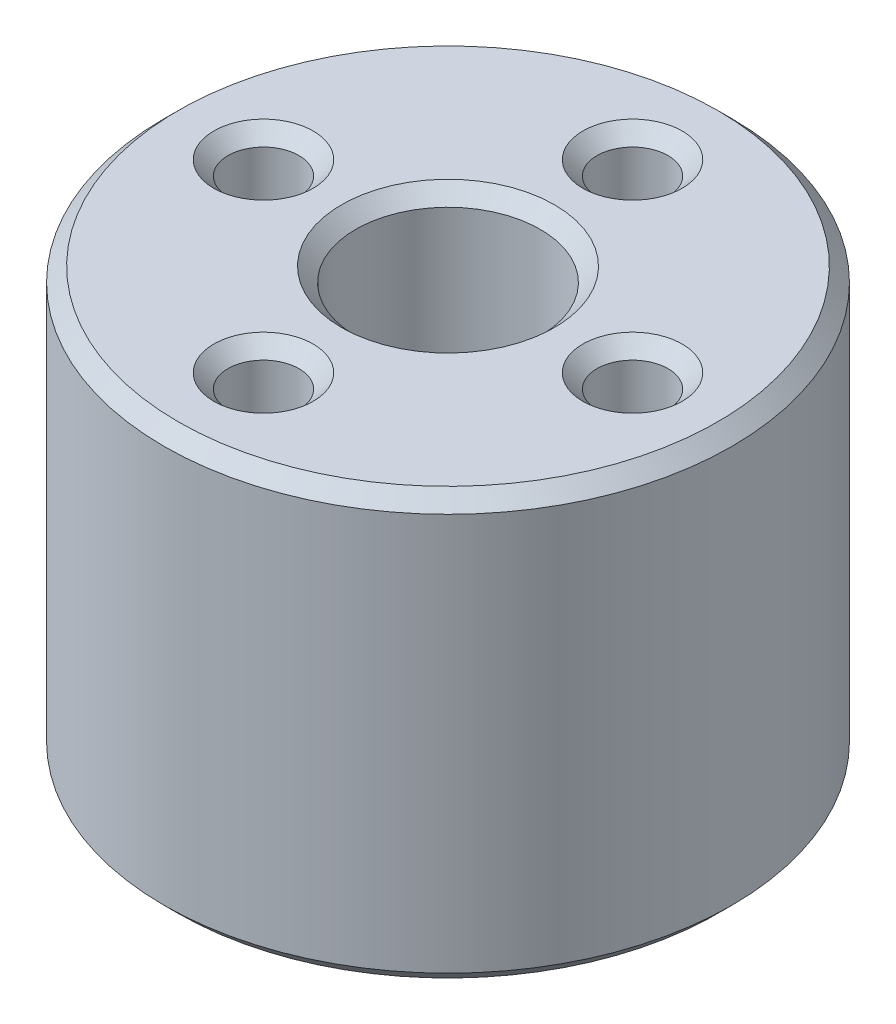
ISO-10303-21;
HEADER;
FILE_DESCRIPTION(('STEP AP214'),'2;1');
FILE_NAME('part.step','',(''),(''),'','','');
FILE_SCHEMA(('AUTOMOTIVE_DESIGN { 1 0 10303 214 1 1 1 1 }'));
ENDSEC;
DATA;
#1=APPLICATION_CONTEXT('core data for automotive mechanical design processes');
#2=APPLICATION_PROTOCOL_DEFINITION('international standard','automotive_design',2000,#1);
#3=PRODUCT_CONTEXT('',#1,'mechanical');
#4=PRODUCT('Part','Part','',(#3));
#5=PRODUCT_RELATED_PRODUCT_CATEGORY('part','',(#4));
#6=PRODUCT_DEFINITION_FORMATION('','',#4);
#7=PRODUCT_DEFINITION_CONTEXT('part definition',#1,'design');
#8=PRODUCT_DEFINITION('design','',#6,#7);
#9=PRODUCT_DEFINITION_SHAPE('','',#8);
#10=(LENGTH_UNIT() NAMED_UNIT(*) SI_UNIT(.MILLI.,.METRE.));
#11=(NAMED_UNIT(*) PLANE_ANGLE_UNIT() SI_UNIT($,.RADIAN.));
#12=(NAMED_UNIT(*) SI_UNIT($,.STERADIAN.) SOLID_ANGLE_UNIT());
#13=UNCERTAINTY_MEASURE_WITH_UNIT(LENGTH_MEASURE(1.E-05),#10,'distance_accuracy_value','');
#14=(GEOMETRIC_REPRESENTATION_CONTEXT(3) GLOBAL_UNCERTAINTY_ASSIGNED_CONTEXT((#13)) GLOBAL_UNIT_ASSIGNED_CONTEXT((#10,
#11,#12)) REPRESENTATION_CONTEXT('',''));
#15=CARTESIAN_POINT('',(0.,0.,0.));
#16=DIRECTION('',(0.,0.,1.));
#17=DIRECTION('',(1.,0.,0.));
#18=AXIS2_PLACEMENT_3D('',#15,#16,#17);
#19=CARTESIAN_POINT('',(0.,15.,0.));
#20=DIRECTION('',(0.,1.,0.));
#21=DIRECTION('',(0.,0.,1.));
#22=AXIS2_PLACEMENT_3D('',#19,#20,#21);
#23=PLANE('',#22);
#24=CARTESIAN_POINT('',(0.,15.,0.));
#25=DIRECTION('',(0.,1.,0.));
#26=DIRECTION('',(0.,0.,1.));
#27=AXIS2_PLACEMENT_3D('',#24,#25,#26);
#28=CIRCLE('',#27,9.5);
#29=CARTESIAN_POINT('',(0.,15.,9.5));
#30=VERTEX_POINT('',#29);
#31=EDGE_CURVE('E80',#30,#30,#28,.T.);
#32=ORIENTED_EDGE('',*,*,#31,.T.);
#33=EDGE_LOOP('',(#32));
#34=FACE_BOUND('',#33,.T.);
#35=CARTESIAN_POINT('',(0.,15.,-6.5));
#36=DIRECTION('',(0.,1.,0.));
#37=DIRECTION('',(0.,0.,1.));
#38=AXIS2_PLACEMENT_3D('',#35,#36,#37);
#39=CIRCLE('',#38,1.75);
#40=CARTESIAN_POINT('',(0.,15.,-4.75));
#41=VERTEX_POINT('',#40);
#42=EDGE_CURVE('E83',#41,#41,#39,.F.);
#43=ORIENTED_EDGE('',*,*,#42,.T.);
#44=EDGE_LOOP('',(#43));
#45=FACE_BOUND('',#44,.T.);
#46=CARTESIAN_POINT('',(6.5,15.,0.));
#47=DIRECTION('',(0.,1.,0.));
#48=DIRECTION('',(0.,0.,1.));
#49=AXIS2_PLACEMENT_3D('',#46,#47,#48);
#50=CIRCLE('',#49,1.75);
#51=CARTESIAN_POINT('',(6.5,15.,1.75));
#52=VERTEX_POINT('',#51);
#53=EDGE_CURVE('E86',#52,#52,#50,.F.);
#54=ORIENTED_EDGE('',*,*,#53,.T.);
#55=EDGE_LOOP('',(#54));
#56=FACE_BOUND('',#55,.T.);
#57=CARTESIAN_POINT('',(0.,15.,0.));
#58=DIRECTION('',(0.,1.,0.));
#59=DIRECTION('',(0.,0.,1.));
#60=AXIS2_PLACEMENT_3D('',#57,#58,#59);
#61=CIRCLE('',#60,3.75);
#62=CARTESIAN_POINT('',(0.,15.,3.75));
#63=VERTEX_POINT('',#62);
#64=EDGE_CURVE('E89',#63,#63,#61,.F.);
#65=ORIENTED_EDGE('',*,*,#64,.T.);
#66=EDGE_LOOP('',(#65));
#67=FACE_BOUND('',#66,.T.);
#68=CARTESIAN_POINT('',(0.,15.,6.5));
#69=DIRECTION('',(0.,1.,0.));
#70=DIRECTION('',(0.,0.,1.));
#71=AXIS2_PLACEMENT_3D('',#68,#69,#70);
#72=CIRCLE('',#71,1.75);
#73=CARTESIAN_POINT('',(0.,15.,8.25));
#74=VERTEX_POINT('',#73);
#75=EDGE_CURVE('E92',#74,#74,#72,.F.);
#76=ORIENTED_EDGE('',*,*,#75,.T.);
#77=EDGE_LOOP('',(#76));
#78=FACE_BOUND('',#77,.T.);
#79=CARTESIAN_POINT('',(-6.5,15.,0.));
#80=DIRECTION('',(0.,1.,0.));
#81=DIRECTION('',(0.,0.,1.));
#82=AXIS2_PLACEMENT_3D('',#79,#80,#81);
#83=CIRCLE('',#82,1.75);
#84=CARTESIAN_POINT('',(-6.5,15.,1.75));
#85=VERTEX_POINT('',#84);
#86=EDGE_CURVE('E95',#85,#85,#83,.F.);
#87=ORIENTED_EDGE('',*,*,#86,.T.);
#88=EDGE_LOOP('',(#87));
#89=FACE_BOUND('',#88,.T.);
#90=ADVANCED_FACE('F41',(#34,#45,#56,#67,#78,#89),#23,.T.);
#91=CARTESIAN_POINT('',(0.,0.,0.));
#92=DIRECTION('',(0.,1.,0.));
#93=DIRECTION('',(0.,0.,1.));
#94=AXIS2_PLACEMENT_3D('',#91,#92,#93);
#95=PLANE('',#94);
#96=CARTESIAN_POINT('',(0.,0.,0.));
#97=DIRECTION('',(0.,1.,0.));
#98=DIRECTION('',(0.,0.,1.));
#99=AXIS2_PLACEMENT_3D('',#96,#97,#98);
#100=CIRCLE('',#99,9.5);
#101=CARTESIAN_POINT('',(0.,0.,9.5));
#102=VERTEX_POINT('',#101);
#103=EDGE_CURVE('E98',#102,#102,#100,.F.);
#104=ORIENTED_EDGE('',*,*,#103,.T.);
#105=EDGE_LOOP('',(#104));
#106=FACE_BOUND('',#105,.T.);
#107=CARTESIAN_POINT('',(0.,0.,-6.5));
#108=DIRECTION('',(0.,1.,0.));
#109=DIRECTION('',(0.,0.,1.));
#110=AXIS2_PLACEMENT_3D('',#107,#108,#109);
#111=CIRCLE('',#110,1.75000000000001);
#112=CARTESIAN_POINT('',(0.,0.,-4.74999999999999));
#113=VERTEX_POINT('',#112);
#114=EDGE_CURVE('E101',#113,#113,#111,.T.);
#115=ORIENTED_EDGE('',*,*,#114,.T.);
#116=EDGE_LOOP('',(#115));
#117=FACE_BOUND('',#116,.T.);
#118=CARTESIAN_POINT('',(6.5,0.,0.));
#119=DIRECTION('',(0.,1.,0.));
#120=DIRECTION('',(0.,0.,1.));
#121=AXIS2_PLACEMENT_3D('',#118,#119,#120);
#122=CIRCLE('',#121,1.75000000000001);
#123=CARTESIAN_POINT('',(6.5,0.,1.75000000000001));
#124=VERTEX_POINT('',#123);
#125=EDGE_CURVE('E104',#124,#124,#122,.T.);
#126=ORIENTED_EDGE('',*,*,#125,.T.);
#127=EDGE_LOOP('',(#126));
#128=FACE_BOUND('',#127,.T.);
#129=CARTESIAN_POINT('',(0.,0.,0.));
#130=DIRECTION('',(0.,1.,0.));
#131=DIRECTION('',(0.,0.,1.));
#132=AXIS2_PLACEMENT_3D('',#129,#130,#131);
#133=CIRCLE('',#132,3.75);
#134=CARTESIAN_POINT('',(0.,0.,3.75));
#135=VERTEX_POINT('',#134);
#136=EDGE_CURVE('E107',#135,#135,#133,.T.);
#137=ORIENTED_EDGE('',*,*,#136,.T.);
#138=EDGE_LOOP('',(#137));
#139=FACE_BOUND('',#138,.T.);
#140=CARTESIAN_POINT('',(0.,0.,6.5));
#141=DIRECTION('',(0.,1.,0.));
#142=DIRECTION('',(0.,0.,1.));
#143=AXIS2_PLACEMENT_3D('',#140,#141,#142);
#144=CIRCLE('',#143,1.75000000000001);
#145=CARTESIAN_POINT('',(0.,0.,8.25));
#146=VERTEX_POINT('',#145);
#147=EDGE_CURVE('E110',#146,#146,#144,.T.);
#148=ORIENTED_EDGE('',*,*,#147,.T.);
#149=EDGE_LOOP('',(#148));
#150=FACE_BOUND('',#149,.T.);
#151=CARTESIAN_POINT('',(-6.5,0.,0.));
#152=DIRECTION('',(0.,1.,0.));
#153=DIRECTION('',(0.,0.,1.));
#154=AXIS2_PLACEMENT_3D('',#151,#152,#153);
#155=CIRCLE('',#154,1.75000000000001);
#156=CARTESIAN_POINT('',(-6.5,0.,1.75000000000001));
#157=VERTEX_POINT('',#156);
#158=EDGE_CURVE('E113',#157,#157,#155,.T.);
#159=ORIENTED_EDGE('',*,*,#158,.T.);
#160=EDGE_LOOP('',(#159));
#161=FACE_BOUND('',#160,.T.);
#162=ADVANCED_FACE('F135',(#106,#117,#128,#139,#150,#161),#95,.F.);
#163=CARTESIAN_POINT('',(0.,15.,0.));
#164=DIRECTION('',(0.,-1.,0.));
#165=DIRECTION('',(0.,0.,-1.));
#166=AXIS2_PLACEMENT_3D('',#163,#164,#165);
#167=CYLINDRICAL_SURFACE('',#166,10.);
#168=CARTESIAN_POINT('',(0.,0.499999999999997,0.));
#169=DIRECTION('',(0.,1.,0.));
#170=DIRECTION('',(0.,0.,1.));
#171=AXIS2_PLACEMENT_3D('',#168,#169,#170);
#172=CIRCLE('',#171,10.);
#173=CARTESIAN_POINT('',(0.,0.499999999999997,10.));
#174=VERTEX_POINT('',#173);
#175=EDGE_CURVE('E116',#174,#174,#172,.T.);
#176=ORIENTED_EDGE('',*,*,#175,.T.);
#177=EDGE_LOOP('',(#176));
#178=FACE_BOUND('',#177,.T.);
#179=CARTESIAN_POINT('',(0.,14.5,0.));
#180=DIRECTION('',(0.,1.,0.));
#181=DIRECTION('',(0.,0.,1.));
#182=AXIS2_PLACEMENT_3D('',#179,#180,#181);
#183=CIRCLE('',#182,10.);
#184=CARTESIAN_POINT('',(0.,14.5,10.));
#185=VERTEX_POINT('',#184);
#186=EDGE_CURVE('E119',#185,#185,#183,.F.);
#187=ORIENTED_EDGE('',*,*,#186,.T.);
#188=EDGE_LOOP('',(#187));
#189=FACE_BOUND('',#188,.T.);
#190=ADVANCED_FACE('F123',(#178,#189),#167,.T.);
#191=CARTESIAN_POINT('',(0.,15.,0.));
#192=DIRECTION('',(0.,-1.,0.));
#193=DIRECTION('',(0.,0.,-1.));
#194=AXIS2_PLACEMENT_3D('',#191,#192,#193);
#195=CYLINDRICAL_SURFACE('',#194,3.25);
#196=CARTESIAN_POINT('',(0.,0.500000000000002,0.));
#197=DIRECTION('',(0.,1.,0.));
#198=DIRECTION('',(0.,0.,1.));
#199=AXIS2_PLACEMENT_3D('',#196,#197,#198);
#200=CIRCLE('',#199,3.25);
#201=CARTESIAN_POINT('',(0.,0.500000000000002,3.25));
#202=VERTEX_POINT('',#201);
#203=EDGE_CURVE('E62',#202,#202,#200,.F.);
#204=ORIENTED_EDGE('',*,*,#203,.T.);
#205=EDGE_LOOP('',(#204));
#206=FACE_BOUND('',#205,.T.);
#207=CARTESIAN_POINT('',(0.,14.5,0.));
#208=DIRECTION('',(0.,1.,0.));
#209=DIRECTION('',(0.,0.,1.));
#210=AXIS2_PLACEMENT_3D('',#207,#208,#209);
#211=CIRCLE('',#210,3.25);
#212=CARTESIAN_POINT('',(0.,14.5,3.25));
#213=VERTEX_POINT('',#212);
#214=EDGE_CURVE('E65',#213,#213,#211,.T.);
#215=ORIENTED_EDGE('',*,*,#214,.T.);
#216=EDGE_LOOP('',(#215));
#217=FACE_BOUND('',#216,.T.);
#218=ADVANCED_FACE('F225',(#206,#217),#195,.F.);
#219=CARTESIAN_POINT('',(-6.5,0.,0.));
#220=DIRECTION('',(0.,1.,0.));
#221=DIRECTION('',(0.,0.,1.));
#222=AXIS2_PLACEMENT_3D('',#219,#220,#221);
#223=CYLINDRICAL_SURFACE('',#222,1.25);
#224=CARTESIAN_POINT('',(-6.5,14.5,0.));
#225=DIRECTION('',(0.,1.,0.));
#226=DIRECTION('',(0.,0.,1.));
#227=AXIS2_PLACEMENT_3D('',#224,#225,#226);
#228=CIRCLE('',#227,1.25);
#229=CARTESIAN_POINT('',(-6.5,14.5,1.25));
#230=VERTEX_POINT('',#229);
#231=EDGE_CURVE('E10',#230,#230,#228,.T.);
#232=ORIENTED_EDGE('',*,*,#231,.T.);
#233=EDGE_LOOP('',(#232));
#234=FACE_BOUND('',#233,.T.);
#235=CARTESIAN_POINT('',(-6.5,0.500000000000004,0.));
#236=DIRECTION('',(0.,1.,0.));
#237=DIRECTION('',(0.,0.,1.));
#238=AXIS2_PLACEMENT_3D('',#235,#236,#237);
#239=CIRCLE('',#238,1.25);
#240=CARTESIAN_POINT('',(-6.5,0.500000000000004,1.25));
#241=VERTEX_POINT('',#240);
#242=EDGE_CURVE('E49',#241,#241,#239,.F.);
#243=ORIENTED_EDGE('',*,*,#242,.T.);
#244=EDGE_LOOP('',(#243));
#245=FACE_BOUND('',#244,.T.);
#246=ADVANCED_FACE('F232',(#234,#245),#223,.F.);
#247=CARTESIAN_POINT('',(0.,0.,6.5));
#248=DIRECTION('',(0.,1.,0.));
#249=DIRECTION('',(0.,0.,1.));
#250=AXIS2_PLACEMENT_3D('',#247,#248,#249);
#251=CYLINDRICAL_SURFACE('',#250,1.25);
#252=CARTESIAN_POINT('',(0.,14.5,6.5));
#253=DIRECTION('',(0.,1.,0.));
#254=DIRECTION('',(0.,0.,1.));
#255=AXIS2_PLACEMENT_3D('',#252,#253,#254);
#256=CIRCLE('',#255,1.25);
#257=CARTESIAN_POINT('',(0.,14.5,7.75));
#258=VERTEX_POINT('',#257);
#259=EDGE_CURVE('E53',#258,#258,#256,.T.);
#260=ORIENTED_EDGE('',*,*,#259,.T.);
#261=EDGE_LOOP('',(#260));
#262=FACE_BOUND('',#261,.T.);
#263=CARTESIAN_POINT('',(0.,0.500000000000004,6.5));
#264=DIRECTION('',(0.,1.,0.));
#265=DIRECTION('',(0.,0.,1.));
#266=AXIS2_PLACEMENT_3D('',#263,#264,#265);
#267=CIRCLE('',#266,1.25);
#268=CARTESIAN_POINT('',(0.,0.500000000000004,7.75));
#269=VERTEX_POINT('',#268);
#270=EDGE_CURVE('E57',#269,#269,#267,.F.);
#271=ORIENTED_EDGE('',*,*,#270,.T.);
#272=EDGE_LOOP('',(#271));
#273=FACE_BOUND('',#272,.T.);
#274=ADVANCED_FACE('F236',(#262,#273),#251,.F.);
#275=CARTESIAN_POINT('',(6.5,0.,0.));
#276=DIRECTION('',(0.,1.,0.));
#277=DIRECTION('',(0.,0.,1.));
#278=AXIS2_PLACEMENT_3D('',#275,#276,#277);
#279=CYLINDRICAL_SURFACE('',#278,1.25);
#280=CARTESIAN_POINT('',(6.5,14.5,0.));
#281=DIRECTION('',(0.,1.,0.));
#282=DIRECTION('',(0.,0.,1.));
#283=AXIS2_PLACEMENT_3D('',#280,#281,#282);
#284=CIRCLE('',#283,1.25);
#285=CARTESIAN_POINT('',(6.5,14.5,1.25));
#286=VERTEX_POINT('',#285);
#287=EDGE_CURVE('E68',#286,#286,#284,.T.);
#288=ORIENTED_EDGE('',*,*,#287,.T.);
#289=EDGE_LOOP('',(#288));
#290=FACE_BOUND('',#289,.T.);
#291=CARTESIAN_POINT('',(6.5,0.500000000000004,0.));
#292=DIRECTION('',(0.,1.,0.));
#293=DIRECTION('',(0.,0.,1.));
#294=AXIS2_PLACEMENT_3D('',#291,#292,#293);
#295=CIRCLE('',#294,1.25);
#296=CARTESIAN_POINT('',(6.5,0.500000000000004,1.25));
#297=VERTEX_POINT('',#296);
#298=EDGE_CURVE('E71',#297,#297,#295,.F.);
#299=ORIENTED_EDGE('',*,*,#298,.T.);
#300=EDGE_LOOP('',(#299));
#301=FACE_BOUND('',#300,.T.);
#302=ADVANCED_FACE('F239',(#290,#301),#279,.F.);
#303=CARTESIAN_POINT('',(0.,0.,-6.5));
#304=DIRECTION('',(0.,1.,0.));
#305=DIRECTION('',(0.,0.,1.));
#306=AXIS2_PLACEMENT_3D('',#303,#304,#305);
#307=CYLINDRICAL_SURFACE('',#306,1.25);
#308=CARTESIAN_POINT('',(0.,14.5,-6.5));
#309=DIRECTION('',(0.,1.,0.));
#310=DIRECTION('',(0.,0.,1.));
#311=AXIS2_PLACEMENT_3D('',#308,#309,#310);
#312=CIRCLE('',#311,1.25);
#313=CARTESIAN_POINT('',(0.,14.5,-5.25));
#314=VERTEX_POINT('',#313);
#315=EDGE_CURVE('E74',#314,#314,#312,.T.);
#316=ORIENTED_EDGE('',*,*,#315,.T.);
#317=EDGE_LOOP('',(#316));
#318=FACE_BOUND('',#317,.T.);
#319=CARTESIAN_POINT('',(0.,0.500000000000004,-6.5));
#320=DIRECTION('',(0.,1.,0.));
#321=DIRECTION('',(0.,0.,1.));
#322=AXIS2_PLACEMENT_3D('',#319,#320,#321);
#323=CIRCLE('',#322,1.25);
#324=CARTESIAN_POINT('',(0.,0.500000000000004,-5.25));
#325=VERTEX_POINT('',#324);
#326=EDGE_CURVE('E77',#325,#325,#323,.F.);
#327=ORIENTED_EDGE('',*,*,#326,.T.);
#328=EDGE_LOOP('',(#327));
#329=FACE_BOUND('',#328,.T.);
#330=ADVANCED_FACE('F221',(#318,#329),#307,.F.);
#331=CARTESIAN_POINT('',(0.,0.499999999999997,0.));
#332=DIRECTION('',(0.,1.,0.));
#333=DIRECTION('',(0.,0.,1.));
#334=AXIS2_PLACEMENT_3D('',#331,#332,#333);
#335=CONICAL_SURFACE('',#334,10.,0.785398163397452);
#336=ORIENTED_EDGE('',*,*,#103,.F.);
#337=EDGE_LOOP('',(#336));
#338=FACE_BOUND('',#337,.T.);
#339=ORIENTED_EDGE('',*,*,#175,.F.);
#340=EDGE_LOOP('',(#339));
#341=FACE_BOUND('',#340,.T.);
#342=ADVANCED_FACE('F129',(#338,#341),#335,.T.);
#343=CARTESIAN_POINT('',(0.,15.,0.));
#344=DIRECTION('',(0.,-1.,0.));
#345=DIRECTION('',(0.,0.,-1.));
#346=AXIS2_PLACEMENT_3D('',#343,#344,#345);
#347=CONICAL_SURFACE('',#346,9.5,0.785398163397452);
#348=ORIENTED_EDGE('',*,*,#186,.F.);
#349=EDGE_LOOP('',(#348));
#350=FACE_BOUND('',#349,.T.);
#351=ORIENTED_EDGE('',*,*,#31,.F.);
#352=EDGE_LOOP('',(#351));
#353=FACE_BOUND('',#352,.T.);
#354=ADVANCED_FACE('F125',(#350,#353),#347,.T.);
#355=CARTESIAN_POINT('',(0.,14.5,-6.5));
#356=DIRECTION('',(0.,1.,0.));
#357=DIRECTION('',(0.,0.,1.));
#358=AXIS2_PLACEMENT_3D('',#355,#356,#357);
#359=CONICAL_SURFACE('',#358,1.25,0.785398163397451);
#360=ORIENTED_EDGE('',*,*,#42,.F.);
#361=EDGE_LOOP('',(#360));
#362=FACE_BOUND('',#361,.T.);
#363=ORIENTED_EDGE('',*,*,#315,.F.);
#364=EDGE_LOOP('',(#363));
#365=FACE_BOUND('',#364,.T.);
#366=ADVANCED_FACE('F128',(#362,#365),#359,.F.);
#367=CARTESIAN_POINT('',(0.,0.,-6.5));
#368=DIRECTION('',(0.,-1.,0.));
#369=DIRECTION('',(0.,0.,-1.));
#370=AXIS2_PLACEMENT_3D('',#367,#368,#369);
#371=CONICAL_SURFACE('',#370,1.75000000000001,0.785398163397449);
#372=ORIENTED_EDGE('',*,*,#326,.F.);
#373=EDGE_LOOP('',(#372));
#374=FACE_BOUND('',#373,.T.);
#375=ORIENTED_EDGE('',*,*,#114,.F.);
#376=EDGE_LOOP('',(#375));
#377=FACE_BOUND('',#376,.T.);
#378=ADVANCED_FACE('F200',(#374,#377),#371,.F.);
#379=CARTESIAN_POINT('',(6.5,14.5,0.));
#380=DIRECTION('',(0.,1.,0.));
#381=DIRECTION('',(0.,0.,1.));
#382=AXIS2_PLACEMENT_3D('',#379,#380,#381);
#383=CONICAL_SURFACE('',#382,1.25,0.785398163397451);
#384=ORIENTED_EDGE('',*,*,#53,.F.);
#385=EDGE_LOOP('',(#384));
#386=FACE_BOUND('',#385,.T.);
#387=ORIENTED_EDGE('',*,*,#287,.F.);
#388=EDGE_LOOP('',(#387));
#389=FACE_BOUND('',#388,.T.);
#390=ADVANCED_FACE('F193',(#386,#389),#383,.F.);
#391=CARTESIAN_POINT('',(6.5,0.,0.));
#392=DIRECTION('',(0.,-1.,0.));
#393=DIRECTION('',(0.,0.,-1.));
#394=AXIS2_PLACEMENT_3D('',#391,#392,#393);
#395=CONICAL_SURFACE('',#394,1.75000000000001,0.785398163397449);
#396=ORIENTED_EDGE('',*,*,#298,.F.);
#397=EDGE_LOOP('',(#396));
#398=FACE_BOUND('',#397,.T.);
#399=ORIENTED_EDGE('',*,*,#125,.F.);
#400=EDGE_LOOP('',(#399));
#401=FACE_BOUND('',#400,.T.);
#402=ADVANCED_FACE('F186',(#398,#401),#395,.F.);
#403=CARTESIAN_POINT('',(0.,0.,0.));
#404=DIRECTION('',(0.,-1.,0.));
#405=DIRECTION('',(0.,0.,-1.));
#406=AXIS2_PLACEMENT_3D('',#403,#404,#405);
#407=CONICAL_SURFACE('',#406,3.75,0.785398163397446);
#408=ORIENTED_EDGE('',*,*,#203,.F.);
#409=EDGE_LOOP('',(#408));
#410=FACE_BOUND('',#409,.T.);
#411=ORIENTED_EDGE('',*,*,#136,.F.);
#412=EDGE_LOOP('',(#411));
#413=FACE_BOUND('',#412,.T.);
#414=ADVANCED_FACE('F179',(#410,#413),#407,.F.);
#415=CARTESIAN_POINT('',(0.,14.5,0.));
#416=DIRECTION('',(0.,1.,0.));
#417=DIRECTION('',(0.,0.,1.));
#418=AXIS2_PLACEMENT_3D('',#415,#416,#417);
#419=CONICAL_SURFACE('',#418,3.25,0.785398163397451);
#420=ORIENTED_EDGE('',*,*,#64,.F.);
#421=EDGE_LOOP('',(#420));
#422=FACE_BOUND('',#421,.T.);
#423=ORIENTED_EDGE('',*,*,#214,.F.);
#424=EDGE_LOOP('',(#423));
#425=FACE_BOUND('',#424,.T.);
#426=ADVANCED_FACE('F172',(#422,#425),#419,.F.);
#427=CARTESIAN_POINT('',(0.,14.5,6.5));
#428=DIRECTION('',(0.,1.,0.));
#429=DIRECTION('',(0.,0.,1.));
#430=AXIS2_PLACEMENT_3D('',#427,#428,#429);
#431=CONICAL_SURFACE('',#430,1.25,0.785398163397451);
#432=ORIENTED_EDGE('',*,*,#75,.F.);
#433=EDGE_LOOP('',(#432));
#434=FACE_BOUND('',#433,.T.);
#435=ORIENTED_EDGE('',*,*,#259,.F.);
#436=EDGE_LOOP('',(#435));
#437=FACE_BOUND('',#436,.T.);
#438=ADVANCED_FACE('F156',(#434,#437),#431,.F.);
#439=CARTESIAN_POINT('',(0.,0.,6.5));
#440=DIRECTION('',(0.,-1.,0.));
#441=DIRECTION('',(0.,0.,-1.));
#442=AXIS2_PLACEMENT_3D('',#439,#440,#441);
#443=CONICAL_SURFACE('',#442,1.75000000000001,0.785398163397449);
#444=ORIENTED_EDGE('',*,*,#270,.F.);
#445=EDGE_LOOP('',(#444));
#446=FACE_BOUND('',#445,.T.);
#447=ORIENTED_EDGE('',*,*,#147,.F.);
#448=EDGE_LOOP('',(#447));
#449=FACE_BOUND('',#448,.T.);
#450=ADVANCED_FACE('F150',(#446,#449),#443,.F.);
#451=CARTESIAN_POINT('',(-6.5,14.5,0.));
#452=DIRECTION('',(0.,1.,0.));
#453=DIRECTION('',(0.,0.,1.));
#454=AXIS2_PLACEMENT_3D('',#451,#452,#453);
#455=CONICAL_SURFACE('',#454,1.25,0.785398163397451);
#456=ORIENTED_EDGE('',*,*,#86,.F.);
#457=EDGE_LOOP('',(#456));
#458=FACE_BOUND('',#457,.T.);
#459=ORIENTED_EDGE('',*,*,#231,.F.);
#460=EDGE_LOOP('',(#459));
#461=FACE_BOUND('',#460,.T.);
#462=ADVANCED_FACE('F147',(#458,#461),#455,.F.);
#463=CARTESIAN_POINT('',(-6.5,0.,0.));
#464=DIRECTION('',(0.,-1.,0.));
#465=DIRECTION('',(0.,0.,-1.));
#466=AXIS2_PLACEMENT_3D('',#463,#464,#465);
#467=CONICAL_SURFACE('',#466,1.75000000000001,0.785398163397449);
#468=ORIENTED_EDGE('',*,*,#242,.F.);
#469=EDGE_LOOP('',(#468));
#470=FACE_BOUND('',#469,.T.);
#471=ORIENTED_EDGE('',*,*,#158,.F.);
#472=EDGE_LOOP('',(#471));
#473=FACE_BOUND('',#472,.T.);
#474=ADVANCED_FACE('F44',(#470,#473),#467,.F.);
#475=CLOSED_SHELL('',(#90,#162,#190,#218,#246,#274,#302,#330,#342,#354,#366,#378,#390,#402,#414,
#426,#438,#450,#462,#474));
#476=MANIFOLD_SOLID_BREP('B2',#475);
#477=ADVANCED_BREP_SHAPE_REPRESENTATION('',(#18,#476),#14);
#478=SHAPE_DEFINITION_REPRESENTATION(#9,#477);
ENDSEC;
END-ISO-10303-21;
